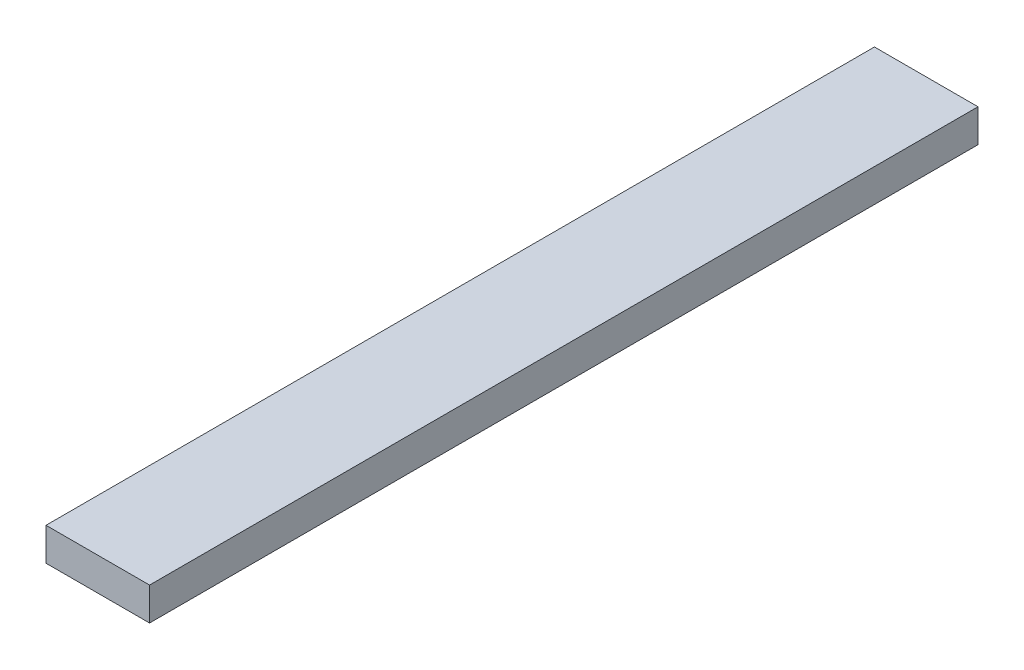
ISO-10303-21;
HEADER;
FILE_DESCRIPTION(('STEP AP214'),'2;1');
FILE_NAME('part.step','',(''),(''),'','','');
FILE_SCHEMA(('AUTOMOTIVE_DESIGN { 1 0 10303 214 1 1 1 1 }'));
ENDSEC;
DATA;
#1=APPLICATION_CONTEXT('core data for automotive mechanical design processes');
#2=APPLICATION_PROTOCOL_DEFINITION('international standard','automotive_design',2000,#1);
#3=PRODUCT_CONTEXT('',#1,'mechanical');
#4=PRODUCT('Part','Part','',(#3));
#5=PRODUCT_RELATED_PRODUCT_CATEGORY('part','',(#4));
#6=PRODUCT_DEFINITION_FORMATION('','',#4);
#7=PRODUCT_DEFINITION_CONTEXT('part definition',#1,'design');
#8=PRODUCT_DEFINITION('design','',#6,#7);
#9=PRODUCT_DEFINITION_SHAPE('','',#8);
#10=(LENGTH_UNIT() NAMED_UNIT(*) SI_UNIT(.MILLI.,.METRE.));
#11=(NAMED_UNIT(*) PLANE_ANGLE_UNIT() SI_UNIT($,.RADIAN.));
#12=(NAMED_UNIT(*) SI_UNIT($,.STERADIAN.) SOLID_ANGLE_UNIT());
#13=UNCERTAINTY_MEASURE_WITH_UNIT(LENGTH_MEASURE(1.E-05),#10,'distance_accuracy_value','');
#14=(GEOMETRIC_REPRESENTATION_CONTEXT(3) GLOBAL_UNCERTAINTY_ASSIGNED_CONTEXT((#13)) GLOBAL_UNIT_ASSIGNED_CONTEXT((#10,
#11,#12)) REPRESENTATION_CONTEXT('',''));
#15=CARTESIAN_POINT('',(0.,0.,0.));
#16=DIRECTION('',(0.,0.,1.));
#17=DIRECTION('',(1.,0.,0.));
#18=AXIS2_PLACEMENT_3D('',#15,#16,#17);
#19=CARTESIAN_POINT('',(5.,3.175,40.));
#20=DIRECTION('',(-1.,0.,0.));
#21=DIRECTION('',(0.,0.,1.));
#22=AXIS2_PLACEMENT_3D('',#19,#20,#21);
#23=PLANE('',#22);
#24=DIRECTION('',(0.,0.,-1.));
#25=VECTOR('',#24,1.);
#26=CARTESIAN_POINT('',(5.,0.,40.));
#27=LINE('',#26,#25);
#28=CARTESIAN_POINT('',(5.,0.,40.));
#29=VERTEX_POINT('',#28);
#30=CARTESIAN_POINT('',(5.,0.,-40.));
#31=VERTEX_POINT('',#30);
#32=EDGE_CURVE('E100',#29,#31,#27,.T.);
#33=ORIENTED_EDGE('',*,*,#32,.T.);
#34=DIRECTION('',(0.,-1.,0.));
#35=VECTOR('',#34,1.);
#36=CARTESIAN_POINT('',(5.,3.175,-40.));
#37=LINE('',#36,#35);
#38=CARTESIAN_POINT('',(5.,3.175,-40.));
#39=VERTEX_POINT('',#38);
#40=EDGE_CURVE('E11',#39,#31,#37,.T.);
#41=ORIENTED_EDGE('',*,*,#40,.F.);
#42=DIRECTION('',(0.,0.,-1.));
#43=VECTOR('',#42,1.);
#44=CARTESIAN_POINT('',(5.,3.175,40.));
#45=LINE('',#44,#43);
#46=CARTESIAN_POINT('',(5.,3.175,40.));
#47=VERTEX_POINT('',#46);
#48=EDGE_CURVE('E88',#47,#39,#45,.T.);
#49=ORIENTED_EDGE('',*,*,#48,.F.);
#50=DIRECTION('',(0.,-1.,0.));
#51=VECTOR('',#50,1.);
#52=CARTESIAN_POINT('',(5.,3.175,40.));
#53=LINE('',#52,#51);
#54=EDGE_CURVE('E96',#47,#29,#53,.T.);
#55=ORIENTED_EDGE('',*,*,#54,.T.);
#56=EDGE_LOOP('',(#33,#41,#49,#55));
#57=FACE_BOUND('',#56,.T.);
#58=ADVANCED_FACE('F37',(#57),#23,.F.);
#59=CARTESIAN_POINT('',(-5.,3.175,-40.));
#60=DIRECTION('',(0.,0.,1.));
#61=DIRECTION('',(1.,0.,0.));
#62=AXIS2_PLACEMENT_3D('',#59,#60,#61);
#63=PLANE('',#62);
#64=DIRECTION('',(-1.,0.,0.));
#65=VECTOR('',#64,1.);
#66=CARTESIAN_POINT('',(-5.,0.,-40.));
#67=LINE('',#66,#65);
#68=CARTESIAN_POINT('',(-5.,0.,-40.));
#69=VERTEX_POINT('',#68);
#70=EDGE_CURVE('E92',#31,#69,#67,.T.);
#71=ORIENTED_EDGE('',*,*,#70,.T.);
#72=DIRECTION('',(0.,-1.,0.));
#73=VECTOR('',#72,1.);
#74=CARTESIAN_POINT('',(-5.,3.175,-40.));
#75=LINE('',#74,#73);
#76=CARTESIAN_POINT('',(-5.,3.175,-40.));
#77=VERTEX_POINT('',#76);
#78=EDGE_CURVE('E45',#77,#69,#75,.T.);
#79=ORIENTED_EDGE('',*,*,#78,.F.);
#80=DIRECTION('',(-1.,0.,0.));
#81=VECTOR('',#80,1.);
#82=CARTESIAN_POINT('',(-5.,3.175,-40.));
#83=LINE('',#82,#81);
#84=EDGE_CURVE('E83',#39,#77,#83,.T.);
#85=ORIENTED_EDGE('',*,*,#84,.F.);
#86=ORIENTED_EDGE('',*,*,#40,.T.);
#87=EDGE_LOOP('',(#71,#79,#85,#86));
#88=FACE_BOUND('',#87,.T.);
#89=ADVANCED_FACE('F91',(#88),#63,.F.);
#90=CARTESIAN_POINT('',(-5.,3.175,40.));
#91=DIRECTION('',(1.,0.,0.));
#92=DIRECTION('',(0.,0.,-1.));
#93=AXIS2_PLACEMENT_3D('',#90,#91,#92);
#94=PLANE('',#93);
#95=DIRECTION('',(0.,0.,1.));
#96=VECTOR('',#95,1.);
#97=CARTESIAN_POINT('',(-5.,0.,40.));
#98=LINE('',#97,#96);
#99=CARTESIAN_POINT('',(-5.,0.,40.));
#100=VERTEX_POINT('',#99);
#101=EDGE_CURVE('E70',#69,#100,#98,.T.);
#102=ORIENTED_EDGE('',*,*,#101,.T.);
#103=DIRECTION('',(0.,-1.,0.));
#104=VECTOR('',#103,1.);
#105=CARTESIAN_POINT('',(-5.,3.175,40.));
#106=LINE('',#105,#104);
#107=CARTESIAN_POINT('',(-5.,3.175,40.));
#108=VERTEX_POINT('',#107);
#109=EDGE_CURVE('E93',#108,#100,#106,.T.);
#110=ORIENTED_EDGE('',*,*,#109,.F.);
#111=DIRECTION('',(0.,0.,1.));
#112=VECTOR('',#111,1.);
#113=CARTESIAN_POINT('',(-5.,3.175,40.));
#114=LINE('',#113,#112);
#115=EDGE_CURVE('E86',#77,#108,#114,.T.);
#116=ORIENTED_EDGE('',*,*,#115,.F.);
#117=ORIENTED_EDGE('',*,*,#78,.T.);
#118=EDGE_LOOP('',(#102,#110,#116,#117));
#119=FACE_BOUND('',#118,.T.);
#120=ADVANCED_FACE('F94',(#119),#94,.F.);
#121=CARTESIAN_POINT('',(-5.,3.175,40.));
#122=DIRECTION('',(0.,0.,-1.));
#123=DIRECTION('',(-1.,0.,0.));
#124=AXIS2_PLACEMENT_3D('',#121,#122,#123);
#125=PLANE('',#124);
#126=DIRECTION('',(1.,0.,0.));
#127=VECTOR('',#126,1.);
#128=CARTESIAN_POINT('',(-5.,0.,40.));
#129=LINE('',#128,#127);
#130=EDGE_CURVE('E76',#100,#29,#129,.T.);
#131=ORIENTED_EDGE('',*,*,#130,.T.);
#132=ORIENTED_EDGE('',*,*,#54,.F.);
#133=DIRECTION('',(1.,0.,0.));
#134=VECTOR('',#133,1.);
#135=CARTESIAN_POINT('',(-5.,3.175,40.));
#136=LINE('',#135,#134);
#137=EDGE_CURVE('E53',#108,#47,#136,.T.);
#138=ORIENTED_EDGE('',*,*,#137,.F.);
#139=ORIENTED_EDGE('',*,*,#109,.T.);
#140=EDGE_LOOP('',(#131,#132,#138,#139));
#141=FACE_BOUND('',#140,.T.);
#142=ADVANCED_FACE('F107',(#141),#125,.F.);
#143=CARTESIAN_POINT('',(0.,3.175,0.));
#144=DIRECTION('',(0.,-1.,0.));
#145=DIRECTION('',(0.,0.,-1.));
#146=AXIS2_PLACEMENT_3D('',#143,#144,#145);
#147=PLANE('',#146);
#148=ORIENTED_EDGE('',*,*,#48,.T.);
#149=ORIENTED_EDGE('',*,*,#84,.T.);
#150=ORIENTED_EDGE('',*,*,#115,.T.);
#151=ORIENTED_EDGE('',*,*,#137,.T.);
#152=EDGE_LOOP('',(#148,#149,#150,#151));
#153=FACE_BOUND('',#152,.T.);
#154=ADVANCED_FACE('F84',(#153),#147,.F.);
#155=CARTESIAN_POINT('',(0.,0.,0.));
#156=DIRECTION('',(0.,-1.,0.));
#157=DIRECTION('',(0.,0.,-1.));
#158=AXIS2_PLACEMENT_3D('',#155,#156,#157);
#159=PLANE('',#158);
#160=ORIENTED_EDGE('',*,*,#32,.F.);
#161=ORIENTED_EDGE('',*,*,#130,.F.);
#162=ORIENTED_EDGE('',*,*,#101,.F.);
#163=ORIENTED_EDGE('',*,*,#70,.F.);
#164=EDGE_LOOP('',(#160,#161,#162,#163));
#165=FACE_BOUND('',#164,.T.);
#166=ADVANCED_FACE('F110',(#165),#159,.T.);
#167=CLOSED_SHELL('',(#58,#89,#120,#142,#154,#166));
#168=MANIFOLD_SOLID_BREP('B2',#167);
#169=ADVANCED_BREP_SHAPE_REPRESENTATION('',(#18,#168),#14);
#170=SHAPE_DEFINITION_REPRESENTATION(#9,#169);
ENDSEC;
END-ISO-10303-21;
